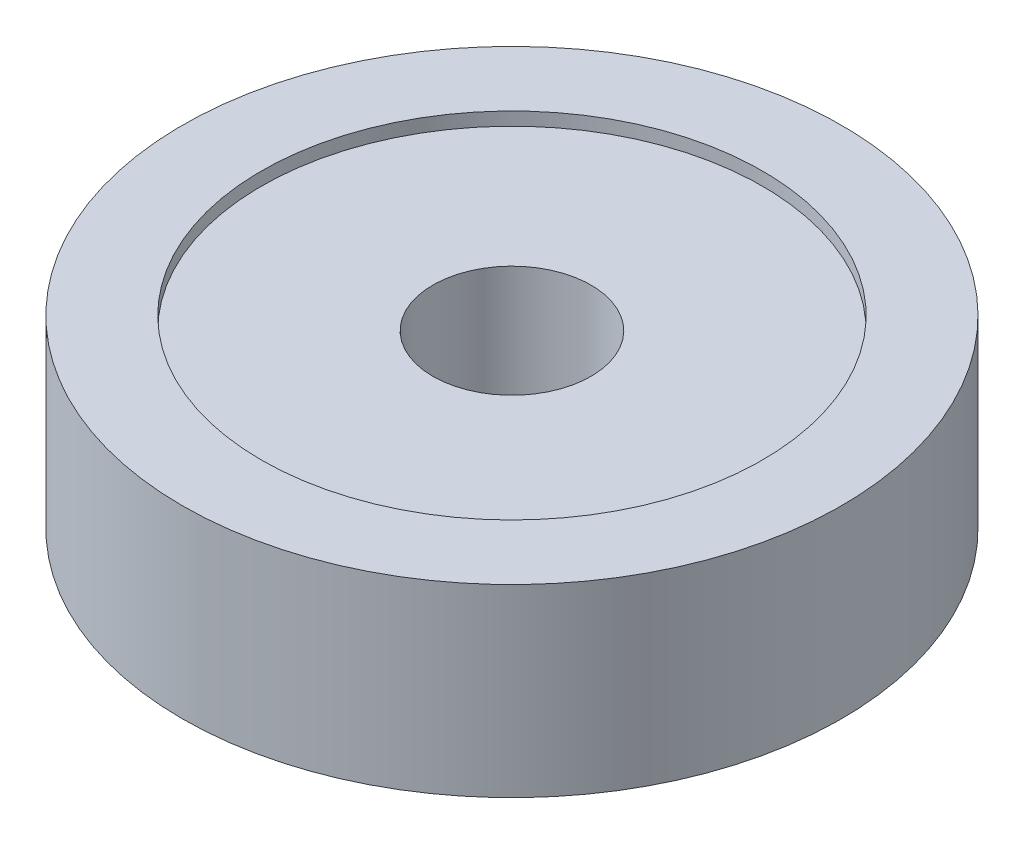
ISO-10303-21;
HEADER;
FILE_DESCRIPTION(('STEP AP214'),'2;1');
FILE_NAME('part.step','',(''),(''),'','','');
FILE_SCHEMA(('AUTOMOTIVE_DESIGN { 1 0 10303 214 1 1 1 1 }'));
ENDSEC;
DATA;
#1=APPLICATION_CONTEXT('core data for automotive mechanical design processes');
#2=APPLICATION_PROTOCOL_DEFINITION('international standard','automotive_design',2000,#1);
#3=PRODUCT_CONTEXT('',#1,'mechanical');
#4=PRODUCT('Part','Part','',(#3));
#5=PRODUCT_RELATED_PRODUCT_CATEGORY('part','',(#4));
#6=PRODUCT_DEFINITION_FORMATION('','',#4);
#7=PRODUCT_DEFINITION_CONTEXT('part definition',#1,'design');
#8=PRODUCT_DEFINITION('design','',#6,#7);
#9=PRODUCT_DEFINITION_SHAPE('','',#8);
#10=(LENGTH_UNIT() NAMED_UNIT(*) SI_UNIT(.MILLI.,.METRE.));
#11=(NAMED_UNIT(*) PLANE_ANGLE_UNIT() SI_UNIT($,.RADIAN.));
#12=(NAMED_UNIT(*) SI_UNIT($,.STERADIAN.) SOLID_ANGLE_UNIT());
#13=UNCERTAINTY_MEASURE_WITH_UNIT(LENGTH_MEASURE(1.E-05),#10,'distance_accuracy_value','');
#14=(GEOMETRIC_REPRESENTATION_CONTEXT(3) GLOBAL_UNCERTAINTY_ASSIGNED_CONTEXT((#13)) GLOBAL_UNIT_ASSIGNED_CONTEXT((#10,
#11,#12)) REPRESENTATION_CONTEXT('',''));
#15=CARTESIAN_POINT('',(0.,0.,0.));
#16=DIRECTION('',(0.,0.,1.));
#17=DIRECTION('',(1.,0.,0.));
#18=AXIS2_PLACEMENT_3D('',#15,#16,#17);
#19=CARTESIAN_POINT('',(0.,3.5,0.));
#20=DIRECTION('',(0.,1.,0.));
#21=DIRECTION('',(0.,0.,1.));
#22=AXIS2_PLACEMENT_3D('',#19,#20,#21);
#23=PLANE('',#22);
#24=CARTESIAN_POINT('',(0.,3.5,0.));
#25=DIRECTION('',(0.,1.,0.));
#26=DIRECTION('',(0.,0.,1.));
#27=AXIS2_PLACEMENT_3D('',#24,#25,#26);
#28=CIRCLE('',#27,12.5);
#29=CARTESIAN_POINT('',(0.,3.5,12.5));
#30=VERTEX_POINT('',#29);
#31=EDGE_CURVE('E11',#30,#30,#28,.T.);
#32=ORIENTED_EDGE('',*,*,#31,.T.);
#33=EDGE_LOOP('',(#32));
#34=FACE_BOUND('',#33,.T.);
#35=CARTESIAN_POINT('',(0.,3.5,0.));
#36=DIRECTION('',(0.,1.,0.));
#37=DIRECTION('',(0.,0.,1.));
#38=AXIS2_PLACEMENT_3D('',#35,#36,#37);
#39=CIRCLE('',#38,9.5);
#40=CARTESIAN_POINT('',(0.,3.5,9.5));
#41=VERTEX_POINT('',#40);
#42=EDGE_CURVE('E62',#41,#41,#39,.T.);
#43=ORIENTED_EDGE('',*,*,#42,.F.);
#44=EDGE_LOOP('',(#43));
#45=FACE_BOUND('',#44,.T.);
#46=ADVANCED_FACE('F51',(#34,#45),#23,.T.);
#47=CARTESIAN_POINT('',(0.,-3.5,0.));
#48=DIRECTION('',(0.,1.,0.));
#49=DIRECTION('',(0.,0.,1.));
#50=AXIS2_PLACEMENT_3D('',#47,#48,#49);
#51=PLANE('',#50);
#52=CARTESIAN_POINT('',(0.,-3.5,0.));
#53=DIRECTION('',(0.,1.,0.));
#54=DIRECTION('',(0.,0.,1.));
#55=AXIS2_PLACEMENT_3D('',#52,#53,#54);
#56=CIRCLE('',#55,12.5);
#57=CARTESIAN_POINT('',(0.,-3.5,12.5));
#58=VERTEX_POINT('',#57);
#59=EDGE_CURVE('E55',#58,#58,#56,.T.);
#60=ORIENTED_EDGE('',*,*,#59,.F.);
#61=EDGE_LOOP('',(#60));
#62=FACE_BOUND('',#61,.T.);
#63=CARTESIAN_POINT('',(0.,-3.5,0.));
#64=DIRECTION('',(0.,1.,0.));
#65=DIRECTION('',(0.,0.,1.));
#66=AXIS2_PLACEMENT_3D('',#63,#64,#65);
#67=CIRCLE('',#66,9.5);
#68=CARTESIAN_POINT('',(0.,-3.5,9.5));
#69=VERTEX_POINT('',#68);
#70=EDGE_CURVE('E64',#69,#69,#67,.T.);
#71=ORIENTED_EDGE('',*,*,#70,.T.);
#72=EDGE_LOOP('',(#71));
#73=FACE_BOUND('',#72,.T.);
#74=ADVANCED_FACE('F74',(#62,#73),#51,.F.);
#75=CARTESIAN_POINT('',(0.,3.5,0.));
#76=DIRECTION('',(0.,-1.,0.));
#77=DIRECTION('',(0.,0.,-1.));
#78=AXIS2_PLACEMENT_3D('',#75,#76,#77);
#79=CYLINDRICAL_SURFACE('',#78,12.5);
#80=ORIENTED_EDGE('',*,*,#31,.F.);
#81=EDGE_LOOP('',(#80));
#82=FACE_BOUND('',#81,.T.);
#83=ORIENTED_EDGE('',*,*,#59,.T.);
#84=EDGE_LOOP('',(#83));
#85=FACE_BOUND('',#84,.T.);
#86=ADVANCED_FACE('F53',(#82,#85),#79,.T.);
#87=CARTESIAN_POINT('',(0.,3.5,0.));
#88=DIRECTION('',(0.,-1.,0.));
#89=DIRECTION('',(0.,0.,-1.));
#90=AXIS2_PLACEMENT_3D('',#87,#88,#89);
#91=CYLINDRICAL_SURFACE('',#90,9.5);
#92=ORIENTED_EDGE('',*,*,#42,.T.);
#93=EDGE_LOOP('',(#92));
#94=FACE_BOUND('',#93,.T.);
#95=ORIENTED_EDGE('',*,*,#70,.F.);
#96=EDGE_LOOP('',(#95));
#97=FACE_BOUND('',#96,.T.);
#98=ADVANCED_FACE('F70',(#94,#97),#91,.F.);
#99=CLOSED_SHELL('',(#46,#74,#86,#98));
#100=MANIFOLD_SOLID_BREP('B2',#99);
#101=CARTESIAN_POINT('',(0.,3.,0.));
#102=DIRECTION('',(0.,1.,0.));
#103=DIRECTION('',(0.,0.,1.));
#104=AXIS2_PLACEMENT_3D('',#101,#102,#103);
#105=PLANE('',#104);
#106=CARTESIAN_POINT('',(0.,3.,0.));
#107=DIRECTION('',(0.,1.,0.));
#108=DIRECTION('',(0.,0.,1.));
#109=AXIS2_PLACEMENT_3D('',#106,#107,#108);
#110=CIRCLE('',#109,9.5);
#111=CARTESIAN_POINT('',(0.,3.,9.5));
#112=VERTEX_POINT('',#111);
#113=EDGE_CURVE('E50',#112,#112,#110,.T.);
#114=ORIENTED_EDGE('',*,*,#113,.T.);
#115=EDGE_LOOP('',(#114));
#116=FACE_BOUND('',#115,.T.);
#117=CARTESIAN_POINT('',(0.,3.,0.));
#118=DIRECTION('',(0.,1.,0.));
#119=DIRECTION('',(0.,0.,1.));
#120=AXIS2_PLACEMENT_3D('',#117,#118,#119);
#121=CIRCLE('',#120,3.);
#122=CARTESIAN_POINT('',(0.,3.,3.));
#123=VERTEX_POINT('',#122);
#124=EDGE_CURVE('E118',#123,#123,#121,.T.);
#125=ORIENTED_EDGE('',*,*,#124,.F.);
#126=EDGE_LOOP('',(#125));
#127=FACE_BOUND('',#126,.T.);
#128=ADVANCED_FACE('F105',(#116,#127),#105,.T.);
#129=CARTESIAN_POINT('',(0.,-3.,0.));
#130=DIRECTION('',(0.,1.,0.));
#131=DIRECTION('',(0.,0.,1.));
#132=AXIS2_PLACEMENT_3D('',#129,#130,#131);
#133=PLANE('',#132);
#134=CARTESIAN_POINT('',(0.,-3.,0.));
#135=DIRECTION('',(0.,1.,0.));
#136=DIRECTION('',(0.,0.,1.));
#137=AXIS2_PLACEMENT_3D('',#134,#135,#136);
#138=CIRCLE('',#137,9.5);
#139=CARTESIAN_POINT('',(0.,-3.,9.5));
#140=VERTEX_POINT('',#139);
#141=EDGE_CURVE('E109',#140,#140,#138,.T.);
#142=ORIENTED_EDGE('',*,*,#141,.F.);
#143=EDGE_LOOP('',(#142));
#144=FACE_BOUND('',#143,.T.);
#145=CARTESIAN_POINT('',(0.,-3.,0.));
#146=DIRECTION('',(0.,1.,0.));
#147=DIRECTION('',(0.,0.,1.));
#148=AXIS2_PLACEMENT_3D('',#145,#146,#147);
#149=CIRCLE('',#148,3.);
#150=CARTESIAN_POINT('',(0.,-3.,3.));
#151=VERTEX_POINT('',#150);
#152=EDGE_CURVE('E120',#151,#151,#149,.T.);
#153=ORIENTED_EDGE('',*,*,#152,.T.);
#154=EDGE_LOOP('',(#153));
#155=FACE_BOUND('',#154,.T.);
#156=ADVANCED_FACE('F132',(#144,#155),#133,.F.);
#157=CARTESIAN_POINT('',(0.,3.,0.));
#158=DIRECTION('',(0.,-1.,0.));
#159=DIRECTION('',(0.,0.,-1.));
#160=AXIS2_PLACEMENT_3D('',#157,#158,#159);
#161=CYLINDRICAL_SURFACE('',#160,9.5);
#162=ORIENTED_EDGE('',*,*,#113,.F.);
#163=EDGE_LOOP('',(#162));
#164=FACE_BOUND('',#163,.T.);
#165=ORIENTED_EDGE('',*,*,#141,.T.);
#166=EDGE_LOOP('',(#165));
#167=FACE_BOUND('',#166,.T.);
#168=ADVANCED_FACE('F107',(#164,#167),#161,.T.);
#169=CARTESIAN_POINT('',(0.,3.,0.));
#170=DIRECTION('',(0.,-1.,0.));
#171=DIRECTION('',(0.,0.,-1.));
#172=AXIS2_PLACEMENT_3D('',#169,#170,#171);
#173=CYLINDRICAL_SURFACE('',#172,3.);
#174=ORIENTED_EDGE('',*,*,#124,.T.);
#175=EDGE_LOOP('',(#174));
#176=FACE_BOUND('',#175,.T.);
#177=ORIENTED_EDGE('',*,*,#152,.F.);
#178=EDGE_LOOP('',(#177));
#179=FACE_BOUND('',#178,.T.);
#180=ADVANCED_FACE('F128',(#176,#179),#173,.F.);
#181=CLOSED_SHELL('',(#128,#156,#168,#180));
#182=MANIFOLD_SOLID_BREP('B6',#181);
#183=ADVANCED_BREP_SHAPE_REPRESENTATION('',(#18,#100,#182),#14);
#184=SHAPE_DEFINITION_REPRESENTATION(#9,#183);
ENDSEC;
END-ISO-10303-21;
